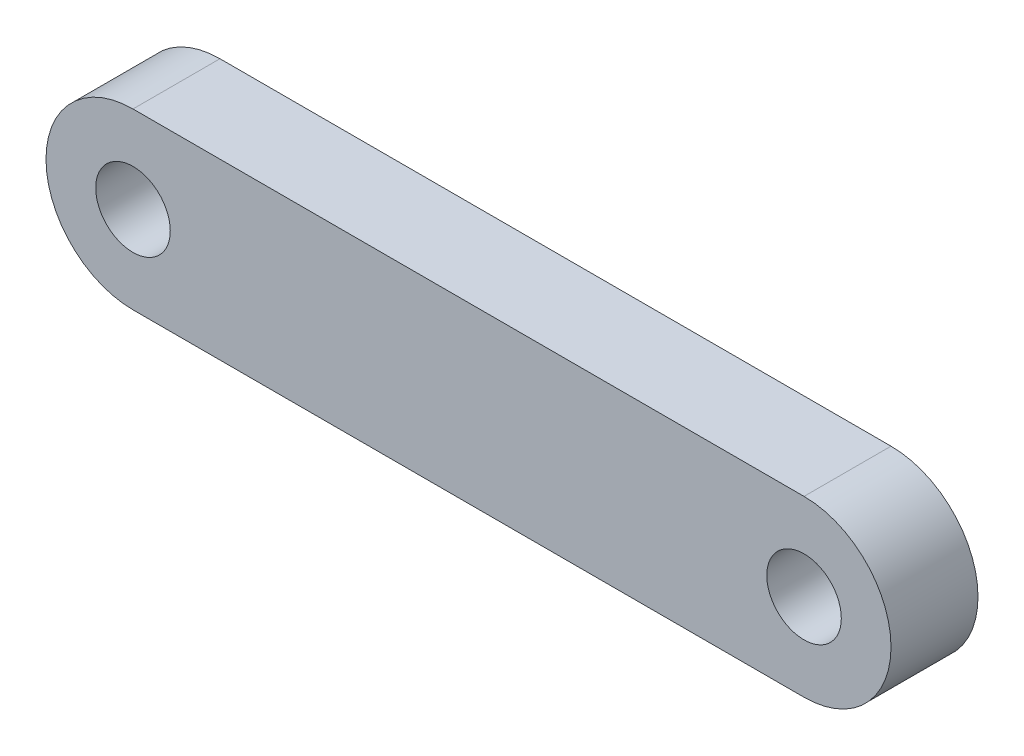
ISO-10303-21;
HEADER;
FILE_DESCRIPTION(('STEP AP214'),'2;1');
FILE_NAME('part.step','',(''),(''),'','','');
FILE_SCHEMA(('AUTOMOTIVE_DESIGN { 1 0 10303 214 1 1 1 1 }'));
ENDSEC;
DATA;
#1=APPLICATION_CONTEXT('core data for automotive mechanical design processes');
#2=APPLICATION_PROTOCOL_DEFINITION('international standard','automotive_design',2000,#1);
#3=PRODUCT_CONTEXT('',#1,'mechanical');
#4=PRODUCT('Part','Part','',(#3));
#5=PRODUCT_RELATED_PRODUCT_CATEGORY('part','',(#4));
#6=PRODUCT_DEFINITION_FORMATION('','',#4);
#7=PRODUCT_DEFINITION_CONTEXT('part definition',#1,'design');
#8=PRODUCT_DEFINITION('design','',#6,#7);
#9=PRODUCT_DEFINITION_SHAPE('','',#8);
#10=(LENGTH_UNIT() NAMED_UNIT(*) SI_UNIT(.MILLI.,.METRE.));
#11=(NAMED_UNIT(*) PLANE_ANGLE_UNIT() SI_UNIT($,.RADIAN.));
#12=(NAMED_UNIT(*) SI_UNIT($,.STERADIAN.) SOLID_ANGLE_UNIT());
#13=UNCERTAINTY_MEASURE_WITH_UNIT(LENGTH_MEASURE(1.E-05),#10,'distance_accuracy_value','');
#14=(GEOMETRIC_REPRESENTATION_CONTEXT(3) GLOBAL_UNCERTAINTY_ASSIGNED_CONTEXT((#13)) GLOBAL_UNIT_ASSIGNED_CONTEXT((#10,
#11,#12)) REPRESENTATION_CONTEXT('',''));
#15=CARTESIAN_POINT('',(0.,0.,0.));
#16=DIRECTION('',(0.,0.,1.));
#17=DIRECTION('',(1.,0.,0.));
#18=AXIS2_PLACEMENT_3D('',#15,#16,#17);
#19=CARTESIAN_POINT('',(0.,-3.5,3.5));
#20=DIRECTION('',(0.,0.,-1.));
#21=DIRECTION('',(-1.,0.,0.));
#22=AXIS2_PLACEMENT_3D('',#19,#20,#21);
#23=PLANE('',#22);
#24=CARTESIAN_POINT('',(0.,-3.5,3.5));
#25=DIRECTION('',(0.,0.,1.));
#26=DIRECTION('',(-1.,0.,0.));
#27=AXIS2_PLACEMENT_3D('',#24,#25,#26);
#28=CIRCLE('',#27,3.5);
#29=CARTESIAN_POINT('',(0.,0.,3.5));
#30=VERTEX_POINT('',#29);
#31=CARTESIAN_POINT('',(0.,-7.,3.5));
#32=VERTEX_POINT('',#31);
#33=EDGE_CURVE('E96',#30,#32,#28,.T.);
#34=ORIENTED_EDGE('',*,*,#33,.T.);
#35=DIRECTION('',(1.,0.,0.));
#36=VECTOR('',#35,1.);
#37=CARTESIAN_POINT('',(0.,-7.,3.5));
#38=LINE('',#37,#36);
#39=CARTESIAN_POINT('',(27.,-7.,3.5));
#40=VERTEX_POINT('',#39);
#41=EDGE_CURVE('E91',#32,#40,#38,.T.);
#42=ORIENTED_EDGE('',*,*,#41,.T.);
#43=CARTESIAN_POINT('',(27.,-3.5,3.5));
#44=DIRECTION('',(0.,0.,1.));
#45=DIRECTION('',(-1.,0.,0.));
#46=AXIS2_PLACEMENT_3D('',#43,#44,#45);
#47=CIRCLE('',#46,3.5);
#48=CARTESIAN_POINT('',(27.,0.,3.5));
#49=VERTEX_POINT('',#48);
#50=EDGE_CURVE('E94',#40,#49,#47,.T.);
#51=ORIENTED_EDGE('',*,*,#50,.T.);
#52=DIRECTION('',(-1.,0.,0.));
#53=VECTOR('',#52,1.);
#54=CARTESIAN_POINT('',(0.,0.,3.5));
#55=LINE('',#54,#53);
#56=EDGE_CURVE('E61',#49,#30,#55,.T.);
#57=ORIENTED_EDGE('',*,*,#56,.T.);
#58=EDGE_LOOP('',(#34,#42,#51,#57));
#59=FACE_BOUND('',#58,.T.);
#60=CARTESIAN_POINT('',(0.,-3.5,3.5));
#61=DIRECTION('',(0.,0.,1.));
#62=DIRECTION('',(1.,0.,0.));
#63=AXIS2_PLACEMENT_3D('',#60,#61,#62);
#64=CIRCLE('',#63,1.5);
#65=CARTESIAN_POINT('',(1.5,-3.5,3.5));
#66=VERTEX_POINT('',#65);
#67=EDGE_CURVE('E111',#66,#66,#64,.T.);
#68=ORIENTED_EDGE('',*,*,#67,.F.);
#69=EDGE_LOOP('',(#68));
#70=FACE_BOUND('',#69,.T.);
#71=CARTESIAN_POINT('',(27.,-3.5,3.5));
#72=DIRECTION('',(0.,0.,1.));
#73=DIRECTION('',(1.,0.,0.));
#74=AXIS2_PLACEMENT_3D('',#71,#72,#73);
#75=CIRCLE('',#74,1.5);
#76=CARTESIAN_POINT('',(28.5,-3.5,3.5));
#77=VERTEX_POINT('',#76);
#78=EDGE_CURVE('E126',#77,#77,#75,.T.);
#79=ORIENTED_EDGE('',*,*,#78,.F.);
#80=EDGE_LOOP('',(#79));
#81=FACE_BOUND('',#80,.T.);
#82=ADVANCED_FACE('F44',(#59,#70,#81),#23,.F.);
#83=CARTESIAN_POINT('',(0.,-3.5,0.));
#84=DIRECTION('',(0.,0.,-1.));
#85=DIRECTION('',(-1.,0.,0.));
#86=AXIS2_PLACEMENT_3D('',#83,#84,#85);
#87=PLANE('',#86);
#88=CARTESIAN_POINT('',(0.,-3.5,0.));
#89=DIRECTION('',(0.,0.,1.));
#90=DIRECTION('',(1.,0.,0.));
#91=AXIS2_PLACEMENT_3D('',#88,#89,#90);
#92=CIRCLE('',#91,1.5);
#93=CARTESIAN_POINT('',(1.5,-3.5,0.));
#94=VERTEX_POINT('',#93);
#95=EDGE_CURVE('E123',#94,#94,#92,.T.);
#96=ORIENTED_EDGE('',*,*,#95,.T.);
#97=EDGE_LOOP('',(#96));
#98=FACE_BOUND('',#97,.T.);
#99=CARTESIAN_POINT('',(0.,-3.5,0.));
#100=DIRECTION('',(0.,0.,1.));
#101=DIRECTION('',(-1.,0.,0.));
#102=AXIS2_PLACEMENT_3D('',#99,#100,#101);
#103=CIRCLE('',#102,3.5);
#104=CARTESIAN_POINT('',(0.,0.,0.));
#105=VERTEX_POINT('',#104);
#106=CARTESIAN_POINT('',(0.,-7.,0.));
#107=VERTEX_POINT('',#106);
#108=EDGE_CURVE('E108',#105,#107,#103,.T.);
#109=ORIENTED_EDGE('',*,*,#108,.F.);
#110=DIRECTION('',(-1.,0.,0.));
#111=VECTOR('',#110,1.);
#112=CARTESIAN_POINT('',(0.,0.,0.));
#113=LINE('',#112,#111);
#114=CARTESIAN_POINT('',(27.,0.,0.));
#115=VERTEX_POINT('',#114);
#116=EDGE_CURVE('E84',#115,#105,#113,.T.);
#117=ORIENTED_EDGE('',*,*,#116,.F.);
#118=CARTESIAN_POINT('',(27.,-3.5,0.));
#119=DIRECTION('',(0.,0.,1.));
#120=DIRECTION('',(-1.,0.,0.));
#121=AXIS2_PLACEMENT_3D('',#118,#119,#120);
#122=CIRCLE('',#121,3.5);
#123=CARTESIAN_POINT('',(27.,-7.,0.));
#124=VERTEX_POINT('',#123);
#125=EDGE_CURVE('E78',#124,#115,#122,.T.);
#126=ORIENTED_EDGE('',*,*,#125,.F.);
#127=DIRECTION('',(1.,0.,0.));
#128=VECTOR('',#127,1.);
#129=CARTESIAN_POINT('',(0.,-7.,0.));
#130=LINE('',#129,#128);
#131=EDGE_CURVE('E100',#107,#124,#130,.T.);
#132=ORIENTED_EDGE('',*,*,#131,.F.);
#133=EDGE_LOOP('',(#109,#117,#126,#132));
#134=FACE_BOUND('',#133,.T.);
#135=CARTESIAN_POINT('',(27.,-3.5,0.));
#136=DIRECTION('',(0.,0.,1.));
#137=DIRECTION('',(1.,0.,0.));
#138=AXIS2_PLACEMENT_3D('',#135,#136,#137);
#139=CIRCLE('',#138,1.5);
#140=CARTESIAN_POINT('',(28.5,-3.5,0.));
#141=VERTEX_POINT('',#140);
#142=EDGE_CURVE('E129',#141,#141,#139,.T.);
#143=ORIENTED_EDGE('',*,*,#142,.T.);
#144=EDGE_LOOP('',(#143));
#145=FACE_BOUND('',#144,.T.);
#146=ADVANCED_FACE('F119',(#98,#134,#145),#87,.T.);
#147=CARTESIAN_POINT('',(0.,-3.5,3.5));
#148=DIRECTION('',(0.,0.,-1.));
#149=DIRECTION('',(-1.,0.,0.));
#150=AXIS2_PLACEMENT_3D('',#147,#148,#149);
#151=CYLINDRICAL_SURFACE('',#150,3.5);
#152=ORIENTED_EDGE('',*,*,#108,.T.);
#153=DIRECTION('',(0.,0.,-1.));
#154=VECTOR('',#153,1.);
#155=CARTESIAN_POINT('',(0.,-7.,3.5));
#156=LINE('',#155,#154);
#157=EDGE_CURVE('E13',#32,#107,#156,.T.);
#158=ORIENTED_EDGE('',*,*,#157,.F.);
#159=ORIENTED_EDGE('',*,*,#33,.F.);
#160=DIRECTION('',(0.,0.,-1.));
#161=VECTOR('',#160,1.);
#162=CARTESIAN_POINT('',(0.,0.,3.5));
#163=LINE('',#162,#161);
#164=EDGE_CURVE('E104',#30,#105,#163,.T.);
#165=ORIENTED_EDGE('',*,*,#164,.T.);
#166=EDGE_LOOP('',(#152,#158,#159,#165));
#167=FACE_BOUND('',#166,.T.);
#168=ADVANCED_FACE('F46',(#167),#151,.T.);
#169=CARTESIAN_POINT('',(0.,-7.,3.5));
#170=DIRECTION('',(0.,1.,0.));
#171=DIRECTION('',(0.,0.,1.));
#172=AXIS2_PLACEMENT_3D('',#169,#170,#171);
#173=PLANE('',#172);
#174=ORIENTED_EDGE('',*,*,#131,.T.);
#175=DIRECTION('',(0.,0.,-1.));
#176=VECTOR('',#175,1.);
#177=CARTESIAN_POINT('',(27.,-7.,3.5));
#178=LINE('',#177,#176);
#179=EDGE_CURVE('E53',#40,#124,#178,.T.);
#180=ORIENTED_EDGE('',*,*,#179,.F.);
#181=ORIENTED_EDGE('',*,*,#41,.F.);
#182=ORIENTED_EDGE('',*,*,#157,.T.);
#183=EDGE_LOOP('',(#174,#180,#181,#182));
#184=FACE_BOUND('',#183,.T.);
#185=ADVANCED_FACE('F99',(#184),#173,.F.);
#186=CARTESIAN_POINT('',(27.,-3.5,3.5));
#187=DIRECTION('',(0.,0.,-1.));
#188=DIRECTION('',(-1.,0.,0.));
#189=AXIS2_PLACEMENT_3D('',#186,#187,#188);
#190=CYLINDRICAL_SURFACE('',#189,3.5);
#191=ORIENTED_EDGE('',*,*,#125,.T.);
#192=DIRECTION('',(0.,0.,-1.));
#193=VECTOR('',#192,1.);
#194=CARTESIAN_POINT('',(27.,0.,3.5));
#195=LINE('',#194,#193);
#196=EDGE_CURVE('E101',#49,#115,#195,.T.);
#197=ORIENTED_EDGE('',*,*,#196,.F.);
#198=ORIENTED_EDGE('',*,*,#50,.F.);
#199=ORIENTED_EDGE('',*,*,#179,.T.);
#200=EDGE_LOOP('',(#191,#197,#198,#199));
#201=FACE_BOUND('',#200,.T.);
#202=ADVANCED_FACE('F102',(#201),#190,.T.);
#203=CARTESIAN_POINT('',(0.,0.,3.5));
#204=DIRECTION('',(0.,-1.,0.));
#205=DIRECTION('',(0.,0.,-1.));
#206=AXIS2_PLACEMENT_3D('',#203,#204,#205);
#207=PLANE('',#206);
#208=ORIENTED_EDGE('',*,*,#116,.T.);
#209=ORIENTED_EDGE('',*,*,#164,.F.);
#210=ORIENTED_EDGE('',*,*,#56,.F.);
#211=ORIENTED_EDGE('',*,*,#196,.T.);
#212=EDGE_LOOP('',(#208,#209,#210,#211));
#213=FACE_BOUND('',#212,.T.);
#214=ADVANCED_FACE('F116',(#213),#207,.F.);
#215=CARTESIAN_POINT('',(0.,-3.5,3.5));
#216=DIRECTION('',(0.,0.,-1.));
#217=DIRECTION('',(-1.,0.,0.));
#218=AXIS2_PLACEMENT_3D('',#215,#216,#217);
#219=CYLINDRICAL_SURFACE('',#218,1.5);
#220=ORIENTED_EDGE('',*,*,#67,.T.);
#221=EDGE_LOOP('',(#220));
#222=FACE_BOUND('',#221,.T.);
#223=ORIENTED_EDGE('',*,*,#95,.F.);
#224=EDGE_LOOP('',(#223));
#225=FACE_BOUND('',#224,.T.);
#226=ADVANCED_FACE('F146',(#222,#225),#219,.F.);
#227=CARTESIAN_POINT('',(27.,-3.5,3.5));
#228=DIRECTION('',(0.,0.,-1.));
#229=DIRECTION('',(-1.,0.,0.));
#230=AXIS2_PLACEMENT_3D('',#227,#228,#229);
#231=CYLINDRICAL_SURFACE('',#230,1.5);
#232=ORIENTED_EDGE('',*,*,#78,.T.);
#233=EDGE_LOOP('',(#232));
#234=FACE_BOUND('',#233,.T.);
#235=ORIENTED_EDGE('',*,*,#142,.F.);
#236=EDGE_LOOP('',(#235));
#237=FACE_BOUND('',#236,.T.);
#238=ADVANCED_FACE('F135',(#234,#237),#231,.F.);
#239=CLOSED_SHELL('',(#82,#146,#168,#185,#202,#214,#226,#238));
#240=MANIFOLD_SOLID_BREP('B2',#239);
#241=ADVANCED_BREP_SHAPE_REPRESENTATION('',(#18,#240),#14);
#242=SHAPE_DEFINITION_REPRESENTATION(#9,#241);
ENDSEC;
END-ISO-10303-21;
